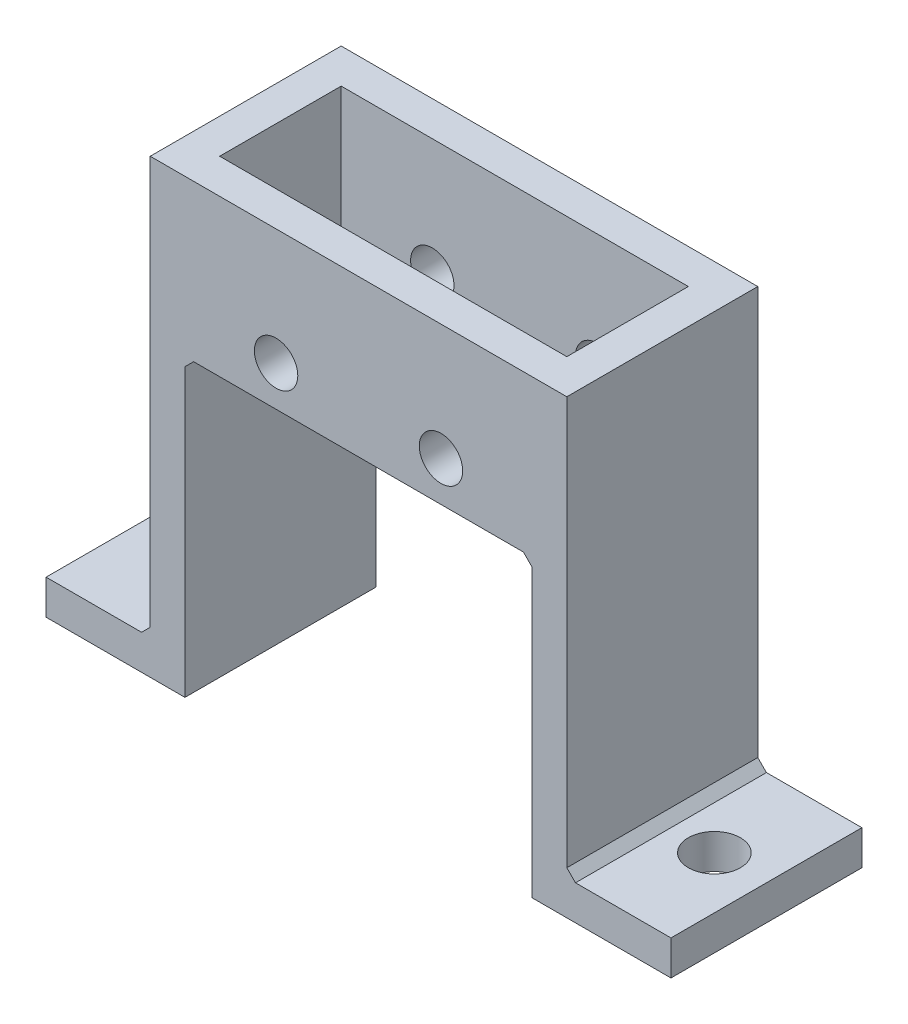
ISO-10303-21;
HEADER;
FILE_DESCRIPTION(('STEP AP214'),'2;1');
FILE_NAME('part.step','',(''),(''),'','','');
FILE_SCHEMA(('AUTOMOTIVE_DESIGN { 1 0 10303 214 1 1 1 1 }'));
ENDSEC;
DATA;
#1=APPLICATION_CONTEXT('core data for automotive mechanical design processes');
#2=APPLICATION_PROTOCOL_DEFINITION('international standard','automotive_design',2000,#1);
#3=PRODUCT_CONTEXT('',#1,'mechanical');
#4=PRODUCT('Part','Part','',(#3));
#5=PRODUCT_RELATED_PRODUCT_CATEGORY('part','',(#4));
#6=PRODUCT_DEFINITION_FORMATION('','',#4);
#7=PRODUCT_DEFINITION_CONTEXT('part definition',#1,'design');
#8=PRODUCT_DEFINITION('design','',#6,#7);
#9=PRODUCT_DEFINITION_SHAPE('','',#8);
#10=(LENGTH_UNIT() NAMED_UNIT(*) SI_UNIT(.MILLI.,.METRE.));
#11=(NAMED_UNIT(*) PLANE_ANGLE_UNIT() SI_UNIT($,.RADIAN.));
#12=(NAMED_UNIT(*) SI_UNIT($,.STERADIAN.) SOLID_ANGLE_UNIT());
#13=UNCERTAINTY_MEASURE_WITH_UNIT(LENGTH_MEASURE(1.E-05),#10,'distance_accuracy_value','');
#14=(GEOMETRIC_REPRESENTATION_CONTEXT(3) GLOBAL_UNCERTAINTY_ASSIGNED_CONTEXT((#13)) GLOBAL_UNIT_ASSIGNED_CONTEXT((#10,
#11,#12)) REPRESENTATION_CONTEXT('',''));
#15=CARTESIAN_POINT('',(0.,0.,0.));
#16=DIRECTION('',(0.,0.,1.));
#17=DIRECTION('',(1.,0.,0.));
#18=AXIS2_PLACEMENT_3D('',#15,#16,#17);
#19=CARTESIAN_POINT('',(20.,10.,-9.));
#20=DIRECTION('',(-1.,0.,0.));
#21=DIRECTION('',(0.,0.,1.));
#22=AXIS2_PLACEMENT_3D('',#19,#20,#21);
#23=PLANE('',#22);
#24=DIRECTION('',(0.,1.,0.));
#25=VECTOR('',#24,1.);
#26=CARTESIAN_POINT('',(20.,-17.,2.));
#27=LINE('',#26,#25);
#28=CARTESIAN_POINT('',(20.,-17.,2.));
#29=VERTEX_POINT('',#28);
#30=CARTESIAN_POINT('',(20.,-0.500000000000007,2.));
#31=VERTEX_POINT('',#30);
#32=EDGE_CURVE('E418',#29,#31,#27,.T.);
#33=ORIENTED_EDGE('',*,*,#32,.T.);
#34=DIRECTION('',(0.,0.,-1.));
#35=VECTOR('',#34,1.);
#36=CARTESIAN_POINT('',(20.,-0.500000000000007,-9.));
#37=LINE('',#36,#35);
#38=CARTESIAN_POINT('',(20.,-0.500000000000007,0.));
#39=VERTEX_POINT('',#38);
#40=EDGE_CURVE('E321',#31,#39,#37,.T.);
#41=ORIENTED_EDGE('',*,*,#40,.T.);
#42=DIRECTION('',(0.,1.,0.));
#43=VECTOR('',#42,1.);
#44=CARTESIAN_POINT('',(20.,0.,0.));
#45=LINE('',#44,#43);
#46=CARTESIAN_POINT('',(20.,9.,0.));
#47=VERTEX_POINT('',#46);
#48=EDGE_CURVE('E237',#39,#47,#45,.T.);
#49=ORIENTED_EDGE('',*,*,#48,.T.);
#50=DIRECTION('',(0.,0.,-1.));
#51=VECTOR('',#50,1.);
#52=CARTESIAN_POINT('',(20.,9.,0.));
#53=LINE('',#52,#51);
#54=CARTESIAN_POINT('',(20.,9.,-7.));
#55=VERTEX_POINT('',#54);
#56=EDGE_CURVE('E222',#47,#55,#53,.T.);
#57=ORIENTED_EDGE('',*,*,#56,.T.);
#58=DIRECTION('',(0.,-1.,0.));
#59=VECTOR('',#58,1.);
#60=CARTESIAN_POINT('',(20.,10.,-7.));
#61=LINE('',#60,#59);
#62=CARTESIAN_POINT('',(20.,-0.500000000000007,-7.));
#63=VERTEX_POINT('',#62);
#64=EDGE_CURVE('E234',#55,#63,#61,.T.);
#65=ORIENTED_EDGE('',*,*,#64,.T.);
#66=DIRECTION('',(0.,0.,-1.));
#67=VECTOR('',#66,1.);
#68=CARTESIAN_POINT('',(20.,-0.500000000000007,-9.));
#69=LINE('',#68,#67);
#70=CARTESIAN_POINT('',(20.,-0.500000000000007,-9.));
#71=VERTEX_POINT('',#70);
#72=EDGE_CURVE('E319',#63,#71,#69,.T.);
#73=ORIENTED_EDGE('',*,*,#72,.T.);
#74=DIRECTION('',(0.,1.,0.));
#75=VECTOR('',#74,1.);
#76=CARTESIAN_POINT('',(20.,-17.,-9.));
#77=LINE('',#76,#75);
#78=CARTESIAN_POINT('',(20.,-17.,-9.));
#79=VERTEX_POINT('',#78);
#80=EDGE_CURVE('E420',#79,#71,#77,.T.);
#81=ORIENTED_EDGE('',*,*,#80,.F.);
#82=DIRECTION('',(0.,0.,-1.));
#83=VECTOR('',#82,1.);
#84=CARTESIAN_POINT('',(20.,-17.,2.));
#85=LINE('',#84,#83);
#86=EDGE_CURVE('E425',#29,#79,#85,.T.);
#87=ORIENTED_EDGE('',*,*,#86,.F.);
#88=EDGE_LOOP('',(#33,#41,#49,#57,#65,#73,#81,#87));
#89=FACE_BOUND('',#88,.T.);
#90=ADVANCED_FACE('F71',(#89),#23,.T.);
#91=CARTESIAN_POINT('',(0.,0.,2.));
#92=DIRECTION('',(0.,0.,1.));
#93=DIRECTION('',(1.,0.,0.));
#94=AXIS2_PLACEMENT_3D('',#91,#92,#93);
#95=PLANE('',#94);
#96=CARTESIAN_POINT('',(5.25,2.3,2.));
#97=DIRECTION('',(0.,0.,1.));
#98=DIRECTION('',(1.,0.,0.));
#99=AXIS2_PLACEMENT_3D('',#96,#97,#98);
#100=CIRCLE('',#99,1.25);
#101=CARTESIAN_POINT('',(6.5,2.3,2.));
#102=VERTEX_POINT('',#101);
#103=EDGE_CURVE('E290',#102,#102,#100,.T.);
#104=ORIENTED_EDGE('',*,*,#103,.F.);
#105=EDGE_LOOP('',(#104));
#106=FACE_BOUND('',#105,.T.);
#107=CARTESIAN_POINT('',(14.75,2.3,2.));
#108=DIRECTION('',(0.,0.,1.));
#109=DIRECTION('',(1.,0.,0.));
#110=AXIS2_PLACEMENT_3D('',#107,#108,#109);
#111=CIRCLE('',#110,1.25);
#112=CARTESIAN_POINT('',(16.,2.3,2.));
#113=VERTEX_POINT('',#112);
#114=EDGE_CURVE('E284',#113,#113,#111,.T.);
#115=ORIENTED_EDGE('',*,*,#114,.F.);
#116=EDGE_LOOP('',(#115));
#117=FACE_BOUND('',#116,.T.);
#118=DIRECTION('',(-1.,0.,0.));
#119=VECTOR('',#118,1.);
#120=CARTESIAN_POINT('',(28.,-15.,2.));
#121=LINE('',#120,#119);
#122=CARTESIAN_POINT('',(28.,-15.,2.));
#123=VERTEX_POINT('',#122);
#124=CARTESIAN_POINT('',(22.5,-15.,2.));
#125=VERTEX_POINT('',#124);
#126=EDGE_CURVE('E413',#123,#125,#121,.T.);
#127=ORIENTED_EDGE('',*,*,#126,.T.);
#128=DIRECTION('',(-0.707106781186552,0.707106781186543,0.));
#129=VECTOR('',#128,1.);
#130=CARTESIAN_POINT('',(22.5,-15.,2.));
#131=LINE('',#130,#129);
#132=CARTESIAN_POINT('',(22.,-14.5,2.));
#133=VERTEX_POINT('',#132);
#134=EDGE_CURVE('E80',#125,#133,#131,.T.);
#135=ORIENTED_EDGE('',*,*,#134,.T.);
#136=DIRECTION('',(0.,1.,0.));
#137=VECTOR('',#136,1.);
#138=CARTESIAN_POINT('',(22.,10.,2.));
#139=LINE('',#138,#137);
#140=CARTESIAN_POINT('',(22.,9.,2.));
#141=VERTEX_POINT('',#140);
#142=EDGE_CURVE('E278',#133,#141,#139,.T.);
#143=ORIENTED_EDGE('',*,*,#142,.T.);
#144=DIRECTION('',(1.,0.,0.));
#145=VECTOR('',#144,1.);
#146=CARTESIAN_POINT('',(-2.,9.,2.));
#147=LINE('',#146,#145);
#148=CARTESIAN_POINT('',(-2.,9.,2.));
#149=VERTEX_POINT('',#148);
#150=EDGE_CURVE('E382',#149,#141,#147,.T.);
#151=ORIENTED_EDGE('',*,*,#150,.F.);
#152=DIRECTION('',(0.,-1.,0.));
#153=VECTOR('',#152,1.);
#154=CARTESIAN_POINT('',(-2.,10.,2.));
#155=LINE('',#154,#153);
#156=CARTESIAN_POINT('',(-2.,-14.5,2.));
#157=VERTEX_POINT('',#156);
#158=EDGE_CURVE('E272',#149,#157,#155,.T.);
#159=ORIENTED_EDGE('',*,*,#158,.T.);
#160=DIRECTION('',(-0.707106781186552,-0.707106781186543,0.));
#161=VECTOR('',#160,1.);
#162=CARTESIAN_POINT('',(-2.5,-15.,2.));
#163=LINE('',#162,#161);
#164=CARTESIAN_POINT('',(-2.5,-15.,2.));
#165=VERTEX_POINT('',#164);
#166=EDGE_CURVE('E350',#157,#165,#163,.T.);
#167=ORIENTED_EDGE('',*,*,#166,.T.);
#168=DIRECTION('',(1.,0.,0.));
#169=VECTOR('',#168,1.);
#170=CARTESIAN_POINT('',(-8.,-15.,2.));
#171=LINE('',#170,#169);
#172=CARTESIAN_POINT('',(-8.,-15.,2.));
#173=VERTEX_POINT('',#172);
#174=EDGE_CURVE('E356',#173,#165,#171,.T.);
#175=ORIENTED_EDGE('',*,*,#174,.F.);
#176=DIRECTION('',(0.,1.,0.));
#177=VECTOR('',#176,1.);
#178=CARTESIAN_POINT('',(-8.,-17.,2.));
#179=LINE('',#178,#177);
#180=CARTESIAN_POINT('',(-8.,-17.,2.));
#181=VERTEX_POINT('',#180);
#182=EDGE_CURVE('E400',#181,#173,#179,.T.);
#183=ORIENTED_EDGE('',*,*,#182,.F.);
#184=DIRECTION('',(-1.,0.,0.));
#185=VECTOR('',#184,1.);
#186=CARTESIAN_POINT('',(-2.,-17.,2.));
#187=LINE('',#186,#185);
#188=CARTESIAN_POINT('',(0.,-17.,2.));
#189=VERTEX_POINT('',#188);
#190=EDGE_CURVE('E262',#189,#181,#187,.T.);
#191=ORIENTED_EDGE('',*,*,#190,.F.);
#192=DIRECTION('',(0.,1.,0.));
#193=VECTOR('',#192,1.);
#194=CARTESIAN_POINT('',(0.,-17.,2.));
#195=LINE('',#194,#193);
#196=CARTESIAN_POINT('',(0.,-0.500000000000007,2.));
#197=VERTEX_POINT('',#196);
#198=EDGE_CURVE('E264',#189,#197,#195,.T.);
#199=ORIENTED_EDGE('',*,*,#198,.T.);
#200=DIRECTION('',(0.707106781186543,0.707106781186552,0.));
#201=VECTOR('',#200,1.);
#202=CARTESIAN_POINT('',(0.,-0.500000000000007,2.));
#203=LINE('',#202,#201);
#204=CARTESIAN_POINT('',(0.5,0.,2.));
#205=VERTEX_POINT('',#204);
#206=EDGE_CURVE('E336',#197,#205,#203,.T.);
#207=ORIENTED_EDGE('',*,*,#206,.T.);
#208=DIRECTION('',(1.,0.,0.));
#209=VECTOR('',#208,1.);
#210=CARTESIAN_POINT('',(0.,0.,2.));
#211=LINE('',#210,#209);
#212=CARTESIAN_POINT('',(19.5,0.,2.));
#213=VERTEX_POINT('',#212);
#214=EDGE_CURVE('E296',#205,#213,#211,.T.);
#215=ORIENTED_EDGE('',*,*,#214,.T.);
#216=DIRECTION('',(0.707106781186543,-0.707106781186552,0.));
#217=VECTOR('',#216,1.);
#218=CARTESIAN_POINT('',(20.,-0.500000000000007,2.));
#219=LINE('',#218,#217);
#220=EDGE_CURVE('E343',#213,#31,#219,.T.);
#221=ORIENTED_EDGE('',*,*,#220,.T.);
#222=ORIENTED_EDGE('',*,*,#32,.F.);
#223=DIRECTION('',(-1.,0.,0.));
#224=VECTOR('',#223,1.);
#225=CARTESIAN_POINT('',(22.,-17.,2.));
#226=LINE('',#225,#224);
#227=CARTESIAN_POINT('',(28.,-17.,2.));
#228=VERTEX_POINT('',#227);
#229=EDGE_CURVE('E427',#228,#29,#226,.T.);
#230=ORIENTED_EDGE('',*,*,#229,.F.);
#231=DIRECTION('',(0.,-1.,0.));
#232=VECTOR('',#231,1.);
#233=CARTESIAN_POINT('',(28.,-17.,2.));
#234=LINE('',#233,#232);
#235=EDGE_CURVE('E368',#123,#228,#234,.T.);
#236=ORIENTED_EDGE('',*,*,#235,.F.);
#237=EDGE_LOOP('',(#127,#135,#143,#151,#159,#167,#175,#183,#191,#199,#207,#215,#221,#222,#230,#236));
#238=FACE_BOUND('',#237,.T.);
#239=ADVANCED_FACE('F354',(#106,#117,#238),#95,.T.);
#240=CARTESIAN_POINT('',(0.,0.,0.));
#241=DIRECTION('',(0.,0.,1.));
#242=DIRECTION('',(1.,0.,0.));
#243=AXIS2_PLACEMENT_3D('',#240,#241,#242);
#244=PLANE('',#243);
#245=CARTESIAN_POINT('',(14.75,2.3,0.));
#246=DIRECTION('',(0.,0.,1.));
#247=DIRECTION('',(1.,0.,0.));
#248=AXIS2_PLACEMENT_3D('',#245,#246,#247);
#249=CIRCLE('',#248,1.25);
#250=CARTESIAN_POINT('',(16.,2.3,0.));
#251=VERTEX_POINT('',#250);
#252=EDGE_CURVE('E275',#251,#251,#249,.T.);
#253=ORIENTED_EDGE('',*,*,#252,.T.);
#254=EDGE_LOOP('',(#253));
#255=FACE_BOUND('',#254,.T.);
#256=CARTESIAN_POINT('',(5.25,2.3,0.));
#257=DIRECTION('',(0.,0.,1.));
#258=DIRECTION('',(1.,0.,0.));
#259=AXIS2_PLACEMENT_3D('',#256,#257,#258);
#260=CIRCLE('',#259,1.25);
#261=CARTESIAN_POINT('',(6.5,2.3,0.));
#262=VERTEX_POINT('',#261);
#263=EDGE_CURVE('E287',#262,#262,#260,.T.);
#264=ORIENTED_EDGE('',*,*,#263,.T.);
#265=EDGE_LOOP('',(#264));
#266=FACE_BOUND('',#265,.T.);
#267=DIRECTION('',(1.,0.,0.));
#268=VECTOR('',#267,1.);
#269=CARTESIAN_POINT('',(20.,9.,0.));
#270=LINE('',#269,#268);
#271=CARTESIAN_POINT('',(0.,9.,0.));
#272=VERTEX_POINT('',#271);
#273=EDGE_CURVE('E383',#272,#47,#270,.T.);
#274=ORIENTED_EDGE('',*,*,#273,.T.);
#275=ORIENTED_EDGE('',*,*,#48,.F.);
#276=DIRECTION('',(-0.707106781186543,0.707106781186552,0.));
#277=VECTOR('',#276,1.);
#278=CARTESIAN_POINT('',(9.75000000000014,9.75,0.));
#279=LINE('',#278,#277);
#280=CARTESIAN_POINT('',(19.5,0.,0.));
#281=VERTEX_POINT('',#280);
#282=EDGE_CURVE('E341',#39,#281,#279,.T.);
#283=ORIENTED_EDGE('',*,*,#282,.T.);
#284=DIRECTION('',(1.,0.,0.));
#285=VECTOR('',#284,1.);
#286=CARTESIAN_POINT('',(0.,0.,0.));
#287=LINE('',#286,#285);
#288=CARTESIAN_POINT('',(0.5,0.,0.));
#289=VERTEX_POINT('',#288);
#290=EDGE_CURVE('E301',#289,#281,#287,.T.);
#291=ORIENTED_EDGE('',*,*,#290,.F.);
#292=DIRECTION('',(-0.707106781186543,-0.707106781186552,0.));
#293=VECTOR('',#292,1.);
#294=CARTESIAN_POINT('',(0.250000000000004,-0.25,0.));
#295=LINE('',#294,#293);
#296=CARTESIAN_POINT('',(0.,-0.500000000000007,0.));
#297=VERTEX_POINT('',#296);
#298=EDGE_CURVE('E338',#289,#297,#295,.T.);
#299=ORIENTED_EDGE('',*,*,#298,.T.);
#300=DIRECTION('',(0.,-1.,0.));
#301=VECTOR('',#300,1.);
#302=CARTESIAN_POINT('',(0.,10.,0.));
#303=LINE('',#302,#301);
#304=EDGE_CURVE('E293',#272,#297,#303,.T.);
#305=ORIENTED_EDGE('',*,*,#304,.F.);
#306=EDGE_LOOP('',(#274,#275,#283,#291,#299,#305));
#307=FACE_BOUND('',#306,.T.);
#308=ADVANCED_FACE('F458',(#255,#266,#307),#244,.F.);
#309=CARTESIAN_POINT('',(22.,10.,-9.));
#310=DIRECTION('',(1.,0.,0.));
#311=DIRECTION('',(0.,0.,-1.));
#312=AXIS2_PLACEMENT_3D('',#309,#310,#311);
#313=PLANE('',#312);
#314=ORIENTED_EDGE('',*,*,#142,.F.);
#315=DIRECTION('',(0.,0.,-1.));
#316=VECTOR('',#315,1.);
#317=CARTESIAN_POINT('',(22.,-14.5,-9.));
#318=LINE('',#317,#316);
#319=CARTESIAN_POINT('',(22.,-14.5,-9.));
#320=VERTEX_POINT('',#319);
#321=EDGE_CURVE('E93',#133,#320,#318,.T.);
#322=ORIENTED_EDGE('',*,*,#321,.T.);
#323=DIRECTION('',(0.,1.,0.));
#324=VECTOR('',#323,1.);
#325=CARTESIAN_POINT('',(22.,10.,-9.));
#326=LINE('',#325,#324);
#327=CARTESIAN_POINT('',(22.,9.,-9.));
#328=VERTEX_POINT('',#327);
#329=EDGE_CURVE('E267',#320,#328,#326,.T.);
#330=ORIENTED_EDGE('',*,*,#329,.T.);
#331=DIRECTION('',(0.,0.,-1.));
#332=VECTOR('',#331,1.);
#333=CARTESIAN_POINT('',(22.,9.,-9.));
#334=LINE('',#333,#332);
#335=EDGE_CURVE('E385',#141,#328,#334,.T.);
#336=ORIENTED_EDGE('',*,*,#335,.F.);
#337=EDGE_LOOP('',(#314,#322,#330,#336));
#338=FACE_BOUND('',#337,.T.);
#339=ADVANCED_FACE('F463',(#338),#313,.T.);
#340=CARTESIAN_POINT('',(0.,10.,-9.));
#341=DIRECTION('',(1.,0.,0.));
#342=DIRECTION('',(0.,0.,-1.));
#343=AXIS2_PLACEMENT_3D('',#340,#341,#342);
#344=PLANE('',#343);
#345=DIRECTION('',(0.,1.,0.));
#346=VECTOR('',#345,1.);
#347=CARTESIAN_POINT('',(0.,10.,-9.));
#348=LINE('',#347,#346);
#349=CARTESIAN_POINT('',(0.,-17.,-9.));
#350=VERTEX_POINT('',#349);
#351=CARTESIAN_POINT('',(0.,-0.5,-9.));
#352=VERTEX_POINT('',#351);
#353=EDGE_CURVE('E268',#350,#352,#348,.T.);
#354=ORIENTED_EDGE('',*,*,#353,.T.);
#355=DIRECTION('',(0.,0.,1.));
#356=VECTOR('',#355,1.);
#357=CARTESIAN_POINT('',(0.,-0.5,-9.));
#358=LINE('',#357,#356);
#359=CARTESIAN_POINT('',(0.,-0.5,-7.));
#360=VERTEX_POINT('',#359);
#361=EDGE_CURVE('E312',#352,#360,#358,.T.);
#362=ORIENTED_EDGE('',*,*,#361,.T.);
#363=DIRECTION('',(0.,1.,0.));
#364=VECTOR('',#363,1.);
#365=CARTESIAN_POINT('',(0.,10.,-7.));
#366=LINE('',#365,#364);
#367=CARTESIAN_POINT('',(0.,9.,-7.));
#368=VERTEX_POINT('',#367);
#369=EDGE_CURVE('E249',#360,#368,#366,.T.);
#370=ORIENTED_EDGE('',*,*,#369,.T.);
#371=DIRECTION('',(0.,0.,1.));
#372=VECTOR('',#371,1.);
#373=CARTESIAN_POINT('',(0.,9.,0.));
#374=LINE('',#373,#372);
#375=EDGE_CURVE('E225',#368,#272,#374,.T.);
#376=ORIENTED_EDGE('',*,*,#375,.T.);
#377=ORIENTED_EDGE('',*,*,#304,.T.);
#378=DIRECTION('',(0.,0.,1.));
#379=VECTOR('',#378,1.);
#380=CARTESIAN_POINT('',(0.,-0.500000000000007,-9.));
#381=LINE('',#380,#379);
#382=EDGE_CURVE('E309',#297,#197,#381,.T.);
#383=ORIENTED_EDGE('',*,*,#382,.T.);
#384=ORIENTED_EDGE('',*,*,#198,.F.);
#385=DIRECTION('',(0.,0.,1.));
#386=VECTOR('',#385,1.);
#387=CARTESIAN_POINT('',(0.,-17.,2.));
#388=LINE('',#387,#386);
#389=EDGE_CURVE('E260',#350,#189,#388,.T.);
#390=ORIENTED_EDGE('',*,*,#389,.F.);
#391=EDGE_LOOP('',(#354,#362,#370,#376,#377,#383,#384,#390));
#392=FACE_BOUND('',#391,.T.);
#393=ADVANCED_FACE('F448',(#392),#344,.T.);
#394=CARTESIAN_POINT('',(-2.,10.,-9.));
#395=DIRECTION('',(-1.,0.,0.));
#396=DIRECTION('',(0.,-1.,0.));
#397=AXIS2_PLACEMENT_3D('',#394,#395,#396);
#398=PLANE('',#397);
#399=DIRECTION('',(0.,-1.,0.));
#400=VECTOR('',#399,1.);
#401=CARTESIAN_POINT('',(-2.,10.,-9.));
#402=LINE('',#401,#400);
#403=CARTESIAN_POINT('',(-2.,9.,-9.));
#404=VERTEX_POINT('',#403);
#405=CARTESIAN_POINT('',(-2.,-14.5,-9.));
#406=VERTEX_POINT('',#405);
#407=EDGE_CURVE('E271',#404,#406,#402,.T.);
#408=ORIENTED_EDGE('',*,*,#407,.T.);
#409=DIRECTION('',(0.,0.,1.));
#410=VECTOR('',#409,1.);
#411=CARTESIAN_POINT('',(-2.,-14.5,-9.));
#412=LINE('',#411,#410);
#413=EDGE_CURVE('E326',#406,#157,#412,.T.);
#414=ORIENTED_EDGE('',*,*,#413,.T.);
#415=ORIENTED_EDGE('',*,*,#158,.F.);
#416=DIRECTION('',(0.,0.,1.));
#417=VECTOR('',#416,1.);
#418=CARTESIAN_POINT('',(-2.,9.,-9.));
#419=LINE('',#418,#417);
#420=EDGE_CURVE('E380',#404,#149,#419,.T.);
#421=ORIENTED_EDGE('',*,*,#420,.F.);
#422=EDGE_LOOP('',(#408,#414,#415,#421));
#423=FACE_BOUND('',#422,.T.);
#424=ADVANCED_FACE('F379',(#423),#398,.T.);
#425=CARTESIAN_POINT('',(0.,0.,-9.));
#426=DIRECTION('',(0.,0.,1.));
#427=DIRECTION('',(1.,0.,0.));
#428=AXIS2_PLACEMENT_3D('',#425,#426,#427);
#429=PLANE('',#428);
#430=CARTESIAN_POINT('',(5.25,2.3,-9.));
#431=DIRECTION('',(0.,0.,-1.));
#432=DIRECTION('',(-1.,0.,0.));
#433=AXIS2_PLACEMENT_3D('',#430,#431,#432);
#434=CIRCLE('',#433,1.25);
#435=CARTESIAN_POINT('',(4.,2.3,-9.));
#436=VERTEX_POINT('',#435);
#437=EDGE_CURVE('E252',#436,#436,#434,.T.);
#438=ORIENTED_EDGE('',*,*,#437,.F.);
#439=EDGE_LOOP('',(#438));
#440=FACE_BOUND('',#439,.T.);
#441=CARTESIAN_POINT('',(14.75,2.3,-9.));
#442=DIRECTION('',(0.,0.,-1.));
#443=DIRECTION('',(-1.,0.,0.));
#444=AXIS2_PLACEMENT_3D('',#441,#442,#443);
#445=CIRCLE('',#444,1.25);
#446=CARTESIAN_POINT('',(13.5,2.3,-9.));
#447=VERTEX_POINT('',#446);
#448=EDGE_CURVE('E429',#447,#447,#445,.T.);
#449=ORIENTED_EDGE('',*,*,#448,.F.);
#450=EDGE_LOOP('',(#449));
#451=FACE_BOUND('',#450,.T.);
#452=DIRECTION('',(-1.,0.,0.));
#453=VECTOR('',#452,1.);
#454=CARTESIAN_POINT('',(-2.,9.,-9.));
#455=LINE('',#454,#453);
#456=EDGE_CURVE('E392',#328,#404,#455,.T.);
#457=ORIENTED_EDGE('',*,*,#456,.F.);
#458=ORIENTED_EDGE('',*,*,#329,.F.);
#459=DIRECTION('',(0.707106781186552,-0.707106781186543,0.));
#460=VECTOR('',#459,1.);
#461=CARTESIAN_POINT('',(3.74999999999985,3.7499999999999,-9.));
#462=LINE('',#461,#460);
#463=CARTESIAN_POINT('',(22.5,-15.,-9.));
#464=VERTEX_POINT('',#463);
#465=EDGE_CURVE('E12',#320,#464,#462,.T.);
#466=ORIENTED_EDGE('',*,*,#465,.T.);
#467=DIRECTION('',(-1.,0.,0.));
#468=VECTOR('',#467,1.);
#469=CARTESIAN_POINT('',(28.,-15.,-9.));
#470=LINE('',#469,#468);
#471=CARTESIAN_POINT('',(28.,-15.,-9.));
#472=VERTEX_POINT('',#471);
#473=EDGE_CURVE('E415',#472,#464,#470,.T.);
#474=ORIENTED_EDGE('',*,*,#473,.F.);
#475=DIRECTION('',(0.,1.,0.));
#476=VECTOR('',#475,1.);
#477=CARTESIAN_POINT('',(28.,-17.,-9.));
#478=LINE('',#477,#476);
#479=CARTESIAN_POINT('',(28.,-17.,-9.));
#480=VERTEX_POINT('',#479);
#481=EDGE_CURVE('E409',#480,#472,#478,.T.);
#482=ORIENTED_EDGE('',*,*,#481,.F.);
#483=DIRECTION('',(1.,0.,0.));
#484=VECTOR('',#483,1.);
#485=CARTESIAN_POINT('',(22.,-17.,-9.));
#486=LINE('',#485,#484);
#487=EDGE_CURVE('E423',#79,#480,#486,.T.);
#488=ORIENTED_EDGE('',*,*,#487,.F.);
#489=ORIENTED_EDGE('',*,*,#80,.T.);
#490=DIRECTION('',(-0.707106781186543,0.707106781186552,0.));
#491=VECTOR('',#490,1.);
#492=CARTESIAN_POINT('',(9.75000000000014,9.75,-9.));
#493=LINE('',#492,#491);
#494=CARTESIAN_POINT('',(19.5,0.,-9.));
#495=VERTEX_POINT('',#494);
#496=EDGE_CURVE('E345',#71,#495,#493,.T.);
#497=ORIENTED_EDGE('',*,*,#496,.T.);
#498=DIRECTION('',(1.,0.,0.));
#499=VECTOR('',#498,1.);
#500=CARTESIAN_POINT('',(22.,0.,-9.));
#501=LINE('',#500,#499);
#502=CARTESIAN_POINT('',(0.500000000000007,0.,-9.));
#503=VERTEX_POINT('',#502);
#504=EDGE_CURVE('E280',#503,#495,#501,.T.);
#505=ORIENTED_EDGE('',*,*,#504,.F.);
#506=DIRECTION('',(-0.707106781186552,-0.707106781186543,0.));
#507=VECTOR('',#506,1.);
#508=CARTESIAN_POINT('',(0.25,-0.250000000000004,-9.));
#509=LINE('',#508,#507);
#510=EDGE_CURVE('E332',#503,#352,#509,.T.);
#511=ORIENTED_EDGE('',*,*,#510,.T.);
#512=ORIENTED_EDGE('',*,*,#353,.F.);
#513=DIRECTION('',(1.,0.,0.));
#514=VECTOR('',#513,1.);
#515=CARTESIAN_POINT('',(-2.,-17.,-9.));
#516=LINE('',#515,#514);
#517=CARTESIAN_POINT('',(-8.,-17.,-9.));
#518=VERTEX_POINT('',#517);
#519=EDGE_CURVE('E257',#518,#350,#516,.T.);
#520=ORIENTED_EDGE('',*,*,#519,.F.);
#521=DIRECTION('',(0.,-1.,0.));
#522=VECTOR('',#521,1.);
#523=CARTESIAN_POINT('',(-8.,-17.,-9.));
#524=LINE('',#523,#522);
#525=CARTESIAN_POINT('',(-8.,-15.,-9.));
#526=VERTEX_POINT('',#525);
#527=EDGE_CURVE('E394',#526,#518,#524,.T.);
#528=ORIENTED_EDGE('',*,*,#527,.F.);
#529=DIRECTION('',(1.,0.,0.));
#530=VECTOR('',#529,1.);
#531=CARTESIAN_POINT('',(-8.,-15.,-9.));
#532=LINE('',#531,#530);
#533=CARTESIAN_POINT('',(-2.5,-15.,-9.));
#534=VERTEX_POINT('',#533);
#535=EDGE_CURVE('E369',#526,#534,#532,.T.);
#536=ORIENTED_EDGE('',*,*,#535,.T.);
#537=DIRECTION('',(0.707106781186552,0.707106781186543,0.));
#538=VECTOR('',#537,1.);
#539=CARTESIAN_POINT('',(6.25000000000001,-6.2500000000001,-9.));
#540=LINE('',#539,#538);
#541=EDGE_CURVE('E348',#534,#406,#540,.T.);
#542=ORIENTED_EDGE('',*,*,#541,.T.);
#543=ORIENTED_EDGE('',*,*,#407,.F.);
#544=EDGE_LOOP('',(#457,#458,#466,#474,#482,#488,#489,#497,#505,#511,#512,#520,#528,#536,#542,#543));
#545=FACE_BOUND('',#544,.T.);
#546=ADVANCED_FACE('F375',(#440,#451,#545),#429,.F.);
#547=CARTESIAN_POINT('',(0.,0.,-7.));
#548=DIRECTION('',(0.,0.,-1.));
#549=DIRECTION('',(-1.,0.,0.));
#550=AXIS2_PLACEMENT_3D('',#547,#548,#549);
#551=PLANE('',#550);
#552=CARTESIAN_POINT('',(5.25,2.3,-7.));
#553=DIRECTION('',(0.,0.,-1.));
#554=DIRECTION('',(-1.,0.,0.));
#555=AXIS2_PLACEMENT_3D('',#552,#553,#554);
#556=CIRCLE('',#555,1.25);
#557=CARTESIAN_POINT('',(4.,2.3,-7.));
#558=VERTEX_POINT('',#557);
#559=EDGE_CURVE('E246',#558,#558,#556,.T.);
#560=ORIENTED_EDGE('',*,*,#559,.T.);
#561=EDGE_LOOP('',(#560));
#562=FACE_BOUND('',#561,.T.);
#563=CARTESIAN_POINT('',(14.75,2.3,-7.));
#564=DIRECTION('',(0.,0.,-1.));
#565=DIRECTION('',(-1.,0.,0.));
#566=AXIS2_PLACEMENT_3D('',#563,#564,#565);
#567=CIRCLE('',#566,1.25);
#568=CARTESIAN_POINT('',(13.5,2.3,-7.));
#569=VERTEX_POINT('',#568);
#570=EDGE_CURVE('E430',#569,#569,#567,.T.);
#571=ORIENTED_EDGE('',*,*,#570,.T.);
#572=EDGE_LOOP('',(#571));
#573=FACE_BOUND('',#572,.T.);
#574=DIRECTION('',(-1.,0.,0.));
#575=VECTOR('',#574,1.);
#576=CARTESIAN_POINT('',(20.,9.,-7.));
#577=LINE('',#576,#575);
#578=EDGE_CURVE('E218',#55,#368,#577,.T.);
#579=ORIENTED_EDGE('',*,*,#578,.T.);
#580=ORIENTED_EDGE('',*,*,#369,.F.);
#581=DIRECTION('',(0.707106781186552,0.707106781186543,0.));
#582=VECTOR('',#581,1.);
#583=CARTESIAN_POINT('',(0.25,-0.250000000000004,-7.));
#584=LINE('',#583,#582);
#585=CARTESIAN_POINT('',(0.500000000000007,0.,-7.));
#586=VERTEX_POINT('',#585);
#587=EDGE_CURVE('E334',#360,#586,#584,.T.);
#588=ORIENTED_EDGE('',*,*,#587,.T.);
#589=DIRECTION('',(-1.,0.,0.));
#590=VECTOR('',#589,1.);
#591=CARTESIAN_POINT('',(20.,0.,-7.));
#592=LINE('',#591,#590);
#593=CARTESIAN_POINT('',(19.5,0.,-7.));
#594=VERTEX_POINT('',#593);
#595=EDGE_CURVE('E245',#594,#586,#592,.T.);
#596=ORIENTED_EDGE('',*,*,#595,.F.);
#597=DIRECTION('',(0.707106781186543,-0.707106781186552,0.));
#598=VECTOR('',#597,1.);
#599=CARTESIAN_POINT('',(9.75000000000014,9.75,-7.));
#600=LINE('',#599,#598);
#601=EDGE_CURVE('E243',#594,#63,#600,.T.);
#602=ORIENTED_EDGE('',*,*,#601,.T.);
#603=ORIENTED_EDGE('',*,*,#64,.F.);
#604=EDGE_LOOP('',(#579,#580,#588,#596,#602,#603));
#605=FACE_BOUND('',#604,.T.);
#606=ADVANCED_FACE('F240',(#562,#573,#605),#551,.F.);
#607=CARTESIAN_POINT('',(0.,0.,2.));
#608=DIRECTION('',(0.,1.,0.));
#609=DIRECTION('',(0.,0.,1.));
#610=AXIS2_PLACEMENT_3D('',#607,#608,#609);
#611=PLANE('',#610);
#612=ORIENTED_EDGE('',*,*,#214,.F.);
#613=DIRECTION('',(0.,0.,-1.));
#614=VECTOR('',#613,1.);
#615=CARTESIAN_POINT('',(0.5,0.,2.));
#616=LINE('',#615,#614);
#617=EDGE_CURVE('E317',#205,#289,#616,.T.);
#618=ORIENTED_EDGE('',*,*,#617,.T.);
#619=ORIENTED_EDGE('',*,*,#290,.T.);
#620=DIRECTION('',(0.,0.,1.));
#621=VECTOR('',#620,1.);
#622=CARTESIAN_POINT('',(19.5,0.,2.));
#623=LINE('',#622,#621);
#624=EDGE_CURVE('E315',#281,#213,#623,.T.);
#625=ORIENTED_EDGE('',*,*,#624,.T.);
#626=EDGE_LOOP('',(#612,#618,#619,#625));
#627=FACE_BOUND('',#626,.T.);
#628=ADVANCED_FACE('F445',(#627),#611,.F.);
#629=ORIENTED_EDGE('',*,*,#595,.T.);
#630=DIRECTION('',(0.,0.,-1.));
#631=VECTOR('',#630,1.);
#632=CARTESIAN_POINT('',(0.500000000000007,0.,2.));
#633=LINE('',#632,#631);
#634=EDGE_CURVE('E306',#586,#503,#633,.T.);
#635=ORIENTED_EDGE('',*,*,#634,.T.);
#636=ORIENTED_EDGE('',*,*,#504,.T.);
#637=DIRECTION('',(0.,0.,1.));
#638=VECTOR('',#637,1.);
#639=CARTESIAN_POINT('',(19.5,0.,2.));
#640=LINE('',#639,#638);
#641=EDGE_CURVE('E299',#495,#594,#640,.T.);
#642=ORIENTED_EDGE('',*,*,#641,.T.);
#643=EDGE_LOOP('',(#629,#635,#636,#642));
#644=FACE_BOUND('',#643,.T.);
#645=ADVANCED_FACE('F473',(#644),#611,.F.);
#646=CARTESIAN_POINT('',(5.25,2.3,2.));
#647=DIRECTION('',(0.,0.,-1.));
#648=DIRECTION('',(-1.,0.,0.));
#649=AXIS2_PLACEMENT_3D('',#646,#647,#648);
#650=CYLINDRICAL_SURFACE('',#649,1.25);
#651=ORIENTED_EDGE('',*,*,#103,.T.);
#652=EDGE_LOOP('',(#651));
#653=FACE_BOUND('',#652,.T.);
#654=ORIENTED_EDGE('',*,*,#263,.F.);
#655=EDGE_LOOP('',(#654));
#656=FACE_BOUND('',#655,.T.);
#657=ADVANCED_FACE('F470',(#653,#656),#650,.F.);
#658=CARTESIAN_POINT('',(14.75,2.3,2.));
#659=DIRECTION('',(0.,0.,-1.));
#660=DIRECTION('',(-1.,0.,0.));
#661=AXIS2_PLACEMENT_3D('',#658,#659,#660);
#662=CYLINDRICAL_SURFACE('',#661,1.25);
#663=ORIENTED_EDGE('',*,*,#114,.T.);
#664=EDGE_LOOP('',(#663));
#665=FACE_BOUND('',#664,.T.);
#666=ORIENTED_EDGE('',*,*,#252,.F.);
#667=EDGE_LOOP('',(#666));
#668=FACE_BOUND('',#667,.T.);
#669=ADVANCED_FACE('F466',(#665,#668),#662,.F.);
#670=CARTESIAN_POINT('',(0.,-17.,0.));
#671=DIRECTION('',(0.,-1.,0.));
#672=DIRECTION('',(0.,0.,-1.));
#673=AXIS2_PLACEMENT_3D('',#670,#671,#672);
#674=PLANE('',#673);
#675=CARTESIAN_POINT('',(-5.,-17.,-3.5));
#676=DIRECTION('',(0.,-1.,0.));
#677=DIRECTION('',(0.,0.,-1.));
#678=AXIS2_PLACEMENT_3D('',#675,#676,#677);
#679=CIRCLE('',#678,1.5);
#680=CARTESIAN_POINT('',(-5.,-17.,-5.));
#681=VERTEX_POINT('',#680);
#682=EDGE_CURVE('E566',#681,#681,#679,.T.);
#683=ORIENTED_EDGE('',*,*,#682,.F.);
#684=EDGE_LOOP('',(#683));
#685=FACE_BOUND('',#684,.T.);
#686=ORIENTED_EDGE('',*,*,#190,.T.);
#687=DIRECTION('',(0.,0.,1.));
#688=VECTOR('',#687,1.);
#689=CARTESIAN_POINT('',(-8.,-17.,-9.));
#690=LINE('',#689,#688);
#691=EDGE_CURVE('E397',#518,#181,#690,.T.);
#692=ORIENTED_EDGE('',*,*,#691,.F.);
#693=ORIENTED_EDGE('',*,*,#519,.T.);
#694=ORIENTED_EDGE('',*,*,#389,.T.);
#695=EDGE_LOOP('',(#686,#692,#693,#694));
#696=FACE_BOUND('',#695,.T.);
#697=ADVANCED_FACE('F469',(#685,#696),#674,.T.);
#698=CARTESIAN_POINT('',(5.25,2.3,-7.));
#699=DIRECTION('',(0.,0.,-1.));
#700=DIRECTION('',(-1.,0.,0.));
#701=AXIS2_PLACEMENT_3D('',#698,#699,#700);
#702=CYLINDRICAL_SURFACE('',#701,1.25);
#703=ORIENTED_EDGE('',*,*,#559,.F.);
#704=EDGE_LOOP('',(#703));
#705=FACE_BOUND('',#704,.T.);
#706=ORIENTED_EDGE('',*,*,#437,.T.);
#707=EDGE_LOOP('',(#706));
#708=FACE_BOUND('',#707,.T.);
#709=ADVANCED_FACE('F596',(#705,#708),#702,.F.);
#710=CARTESIAN_POINT('',(14.75,2.3,-7.));
#711=DIRECTION('',(0.,0.,-1.));
#712=DIRECTION('',(-1.,0.,0.));
#713=AXIS2_PLACEMENT_3D('',#710,#711,#712);
#714=CYLINDRICAL_SURFACE('',#713,1.25);
#715=ORIENTED_EDGE('',*,*,#570,.F.);
#716=EDGE_LOOP('',(#715));
#717=FACE_BOUND('',#716,.T.);
#718=ORIENTED_EDGE('',*,*,#448,.T.);
#719=EDGE_LOOP('',(#718));
#720=FACE_BOUND('',#719,.T.);
#721=ADVANCED_FACE('F436',(#717,#720),#714,.F.);
#722=CARTESIAN_POINT('',(0.,-17.,0.));
#723=DIRECTION('',(0.,1.,0.));
#724=DIRECTION('',(0.,0.,1.));
#725=AXIS2_PLACEMENT_3D('',#722,#723,#724);
#726=PLANE('',#725);
#727=CARTESIAN_POINT('',(25.,-17.,-3.5));
#728=DIRECTION('',(0.,1.,0.));
#729=DIRECTION('',(0.,0.,1.));
#730=AXIS2_PLACEMENT_3D('',#727,#728,#729);
#731=CIRCLE('',#730,1.5);
#732=CARTESIAN_POINT('',(25.,-17.,-2.));
#733=VERTEX_POINT('',#732);
#734=EDGE_CURVE('E238',#733,#733,#731,.T.);
#735=ORIENTED_EDGE('',*,*,#734,.T.);
#736=EDGE_LOOP('',(#735));
#737=FACE_BOUND('',#736,.T.);
#738=ORIENTED_EDGE('',*,*,#487,.T.);
#739=DIRECTION('',(0.,0.,-1.));
#740=VECTOR('',#739,1.);
#741=CARTESIAN_POINT('',(28.,-17.,2.));
#742=LINE('',#741,#740);
#743=EDGE_CURVE('E406',#228,#480,#742,.T.);
#744=ORIENTED_EDGE('',*,*,#743,.F.);
#745=ORIENTED_EDGE('',*,*,#229,.T.);
#746=ORIENTED_EDGE('',*,*,#86,.T.);
#747=EDGE_LOOP('',(#738,#744,#745,#746));
#748=FACE_BOUND('',#747,.T.);
#749=ADVANCED_FACE('F535',(#737,#748),#726,.F.);
#750=CARTESIAN_POINT('',(28.,-15.,2.));
#751=DIRECTION('',(0.,-1.,0.));
#752=DIRECTION('',(0.,0.,-1.));
#753=AXIS2_PLACEMENT_3D('',#750,#751,#752);
#754=PLANE('',#753);
#755=CARTESIAN_POINT('',(25.,-15.,-3.5));
#756=DIRECTION('',(0.,1.,0.));
#757=DIRECTION('',(-1.,0.,0.));
#758=AXIS2_PLACEMENT_3D('',#755,#756,#757);
#759=CIRCLE('',#758,1.5);
#760=CARTESIAN_POINT('',(23.5,-15.,-3.5));
#761=VERTEX_POINT('',#760);
#762=EDGE_CURVE('E570',#761,#761,#759,.T.);
#763=ORIENTED_EDGE('',*,*,#762,.F.);
#764=EDGE_LOOP('',(#763));
#765=FACE_BOUND('',#764,.T.);
#766=ORIENTED_EDGE('',*,*,#473,.T.);
#767=DIRECTION('',(0.,0.,1.));
#768=VECTOR('',#767,1.);
#769=CARTESIAN_POINT('',(22.5,-15.,2.));
#770=LINE('',#769,#768);
#771=EDGE_CURVE('E328',#464,#125,#770,.T.);
#772=ORIENTED_EDGE('',*,*,#771,.T.);
#773=ORIENTED_EDGE('',*,*,#126,.F.);
#774=DIRECTION('',(0.,0.,1.));
#775=VECTOR('',#774,1.);
#776=CARTESIAN_POINT('',(28.,-15.,2.));
#777=LINE('',#776,#775);
#778=EDGE_CURVE('E411',#472,#123,#777,.T.);
#779=ORIENTED_EDGE('',*,*,#778,.F.);
#780=EDGE_LOOP('',(#766,#772,#773,#779));
#781=FACE_BOUND('',#780,.T.);
#782=ADVANCED_FACE('F526',(#765,#781),#754,.F.);
#783=CARTESIAN_POINT('',(28.,0.,0.));
#784=DIRECTION('',(-1.,0.,0.));
#785=DIRECTION('',(0.,0.,1.));
#786=AXIS2_PLACEMENT_3D('',#783,#784,#785);
#787=PLANE('',#786);
#788=ORIENTED_EDGE('',*,*,#235,.T.);
#789=ORIENTED_EDGE('',*,*,#743,.T.);
#790=ORIENTED_EDGE('',*,*,#481,.T.);
#791=ORIENTED_EDGE('',*,*,#778,.T.);
#792=EDGE_LOOP('',(#788,#789,#790,#791));
#793=FACE_BOUND('',#792,.T.);
#794=ADVANCED_FACE('F530',(#793),#787,.F.);
#795=CARTESIAN_POINT('',(-8.,-15.,-9.));
#796=DIRECTION('',(0.,-1.,0.));
#797=DIRECTION('',(1.,0.,0.));
#798=AXIS2_PLACEMENT_3D('',#795,#796,#797);
#799=PLANE('',#798);
#800=CARTESIAN_POINT('',(-5.,-15.,-3.5));
#801=DIRECTION('',(0.,1.,0.));
#802=DIRECTION('',(-1.,0.,0.));
#803=AXIS2_PLACEMENT_3D('',#800,#801,#802);
#804=CIRCLE('',#803,1.5);
#805=CARTESIAN_POINT('',(-6.5,-15.,-3.5));
#806=VERTEX_POINT('',#805);
#807=EDGE_CURVE('E569',#806,#806,#804,.T.);
#808=ORIENTED_EDGE('',*,*,#807,.F.);
#809=EDGE_LOOP('',(#808));
#810=FACE_BOUND('',#809,.T.);
#811=ORIENTED_EDGE('',*,*,#174,.T.);
#812=DIRECTION('',(0.,0.,-1.));
#813=VECTOR('',#812,1.);
#814=CARTESIAN_POINT('',(-2.5,-15.,-9.));
#815=LINE('',#814,#813);
#816=EDGE_CURVE('E323',#165,#534,#815,.T.);
#817=ORIENTED_EDGE('',*,*,#816,.T.);
#818=ORIENTED_EDGE('',*,*,#535,.F.);
#819=DIRECTION('',(0.,0.,-1.));
#820=VECTOR('',#819,1.);
#821=CARTESIAN_POINT('',(-8.,-15.,-9.));
#822=LINE('',#821,#820);
#823=EDGE_CURVE('E367',#173,#526,#822,.T.);
#824=ORIENTED_EDGE('',*,*,#823,.F.);
#825=EDGE_LOOP('',(#811,#817,#818,#824));
#826=FACE_BOUND('',#825,.T.);
#827=ADVANCED_FACE('F364',(#810,#826),#799,.F.);
#828=CARTESIAN_POINT('',(-8.,0.,0.));
#829=DIRECTION('',(1.,0.,0.));
#830=DIRECTION('',(0.,0.,-1.));
#831=AXIS2_PLACEMENT_3D('',#828,#829,#830);
#832=PLANE('',#831);
#833=ORIENTED_EDGE('',*,*,#527,.T.);
#834=ORIENTED_EDGE('',*,*,#691,.T.);
#835=ORIENTED_EDGE('',*,*,#182,.T.);
#836=ORIENTED_EDGE('',*,*,#823,.T.);
#837=EDGE_LOOP('',(#833,#834,#835,#836));
#838=FACE_BOUND('',#837,.T.);
#839=ADVANCED_FACE('F551',(#838),#832,.F.);
#840=CARTESIAN_POINT('',(0.,9.,0.));
#841=DIRECTION('',(0.,1.,0.));
#842=DIRECTION('',(0.,0.,1.));
#843=AXIS2_PLACEMENT_3D('',#840,#841,#842);
#844=PLANE('',#843);
#845=ORIENTED_EDGE('',*,*,#273,.F.);
#846=ORIENTED_EDGE('',*,*,#375,.F.);
#847=ORIENTED_EDGE('',*,*,#578,.F.);
#848=ORIENTED_EDGE('',*,*,#56,.F.);
#849=EDGE_LOOP('',(#845,#846,#847,#848));
#850=FACE_BOUND('',#849,.T.);
#851=ORIENTED_EDGE('',*,*,#420,.T.);
#852=ORIENTED_EDGE('',*,*,#150,.T.);
#853=ORIENTED_EDGE('',*,*,#335,.T.);
#854=ORIENTED_EDGE('',*,*,#456,.T.);
#855=EDGE_LOOP('',(#851,#852,#853,#854));
#856=FACE_BOUND('',#855,.T.);
#857=ADVANCED_FACE('F220',(#850,#856),#844,.T.);
#858=CARTESIAN_POINT('',(-4.99999999999999,-26.,-3.5));
#859=DIRECTION('',(0.,1.,0.));
#860=DIRECTION('',(-1.,0.,0.));
#861=AXIS2_PLACEMENT_3D('',#858,#859,#860);
#862=CYLINDRICAL_SURFACE('',#861,1.5);
#863=ORIENTED_EDGE('',*,*,#682,.T.);
#864=EDGE_LOOP('',(#863));
#865=FACE_BOUND('',#864,.T.);
#866=ORIENTED_EDGE('',*,*,#807,.T.);
#867=EDGE_LOOP('',(#866));
#868=FACE_BOUND('',#867,.T.);
#869=ADVANCED_FACE('F576',(#865,#868),#862,.F.);
#870=CARTESIAN_POINT('',(25.,-26.,-3.5));
#871=DIRECTION('',(0.,1.,0.));
#872=DIRECTION('',(-1.,0.,0.));
#873=AXIS2_PLACEMENT_3D('',#870,#871,#872);
#874=CYLINDRICAL_SURFACE('',#873,1.5);
#875=ORIENTED_EDGE('',*,*,#762,.T.);
#876=EDGE_LOOP('',(#875));
#877=FACE_BOUND('',#876,.T.);
#878=ORIENTED_EDGE('',*,*,#734,.F.);
#879=EDGE_LOOP('',(#878));
#880=FACE_BOUND('',#879,.T.);
#881=ADVANCED_FACE('F490',(#877,#880),#874,.F.);
#882=CARTESIAN_POINT('',(0.500000000000007,0.,2.));
#883=DIRECTION('',(-0.707106781186542,0.707106781186552,0.));
#884=DIRECTION('',(0.,0.,-1.));
#885=AXIS2_PLACEMENT_3D('',#882,#883,#884);
#886=PLANE('',#885);
#887=ORIENTED_EDGE('',*,*,#587,.F.);
#888=ORIENTED_EDGE('',*,*,#361,.F.);
#889=ORIENTED_EDGE('',*,*,#510,.F.);
#890=ORIENTED_EDGE('',*,*,#634,.F.);
#891=EDGE_LOOP('',(#887,#888,#889,#890));
#892=FACE_BOUND('',#891,.T.);
#893=ADVANCED_FACE('F483',(#892),#886,.F.);
#894=CARTESIAN_POINT('',(0.,-0.500000000000007,-9.));
#895=DIRECTION('',(-0.707106781186552,0.707106781186542,0.));
#896=DIRECTION('',(0.,0.,1.));
#897=AXIS2_PLACEMENT_3D('',#894,#895,#896);
#898=PLANE('',#897);
#899=ORIENTED_EDGE('',*,*,#298,.F.);
#900=ORIENTED_EDGE('',*,*,#617,.F.);
#901=ORIENTED_EDGE('',*,*,#206,.F.);
#902=ORIENTED_EDGE('',*,*,#382,.F.);
#903=EDGE_LOOP('',(#899,#900,#901,#902));
#904=FACE_BOUND('',#903,.T.);
#905=ADVANCED_FACE('F489',(#904),#898,.F.);
#906=CARTESIAN_POINT('',(20.,-0.500000000000007,-9.));
#907=DIRECTION('',(0.707106781186552,0.707106781186542,0.));
#908=DIRECTION('',(0.,0.,-1.));
#909=AXIS2_PLACEMENT_3D('',#906,#907,#908);
#910=PLANE('',#909);
#911=ORIENTED_EDGE('',*,*,#220,.F.);
#912=ORIENTED_EDGE('',*,*,#624,.F.);
#913=ORIENTED_EDGE('',*,*,#282,.F.);
#914=ORIENTED_EDGE('',*,*,#40,.F.);
#915=EDGE_LOOP('',(#911,#912,#913,#914));
#916=FACE_BOUND('',#915,.T.);
#917=ADVANCED_FACE('F497',(#916),#910,.F.);
#918=CARTESIAN_POINT('',(20.,-0.500000000000007,-9.));
#919=DIRECTION('',(0.707106781186552,0.707106781186542,0.));
#920=DIRECTION('',(0.,0.,-1.));
#921=AXIS2_PLACEMENT_3D('',#918,#919,#920);
#922=PLANE('',#921);
#923=ORIENTED_EDGE('',*,*,#601,.F.);
#924=ORIENTED_EDGE('',*,*,#641,.F.);
#925=ORIENTED_EDGE('',*,*,#496,.F.);
#926=ORIENTED_EDGE('',*,*,#72,.F.);
#927=EDGE_LOOP('',(#923,#924,#925,#926));
#928=FACE_BOUND('',#927,.T.);
#929=ADVANCED_FACE('F504',(#928),#922,.F.);
#930=CARTESIAN_POINT('',(-2.5,-15.,-9.));
#931=DIRECTION('',(0.707106781186543,-0.707106781186552,0.));
#932=DIRECTION('',(0.,0.,-1.));
#933=AXIS2_PLACEMENT_3D('',#930,#931,#932);
#934=PLANE('',#933);
#935=ORIENTED_EDGE('',*,*,#166,.F.);
#936=ORIENTED_EDGE('',*,*,#413,.F.);
#937=ORIENTED_EDGE('',*,*,#541,.F.);
#938=ORIENTED_EDGE('',*,*,#816,.F.);
#939=EDGE_LOOP('',(#935,#936,#937,#938));
#940=FACE_BOUND('',#939,.T.);
#941=ADVANCED_FACE('F371',(#940),#934,.F.);
#942=CARTESIAN_POINT('',(22.5,-15.,2.));
#943=DIRECTION('',(-0.707106781186542,-0.707106781186552,0.));
#944=DIRECTION('',(0.,0.,1.));
#945=AXIS2_PLACEMENT_3D('',#942,#943,#944);
#946=PLANE('',#945);
#947=ORIENTED_EDGE('',*,*,#465,.F.);
#948=ORIENTED_EDGE('',*,*,#321,.F.);
#949=ORIENTED_EDGE('',*,*,#134,.F.);
#950=ORIENTED_EDGE('',*,*,#771,.F.);
#951=EDGE_LOOP('',(#947,#948,#949,#950));
#952=FACE_BOUND('',#951,.T.);
#953=ADVANCED_FACE('F74',(#952),#946,.F.);
#954=CLOSED_SHELL('',(#90,#239,#308,#339,#393,#424,#546,#606,#628,#645,#657,#669,#697,#709,#721,
#749,#782,#794,#827,#839,#857,#869,#881,#893,#905,#917,#929,#941,#953));
#955=MANIFOLD_SOLID_BREP('B2',#954);
#956=ADVANCED_BREP_SHAPE_REPRESENTATION('',(#18,#955),#14);
#957=SHAPE_DEFINITION_REPRESENTATION(#9,#956);
ENDSEC;
END-ISO-10303-21;
